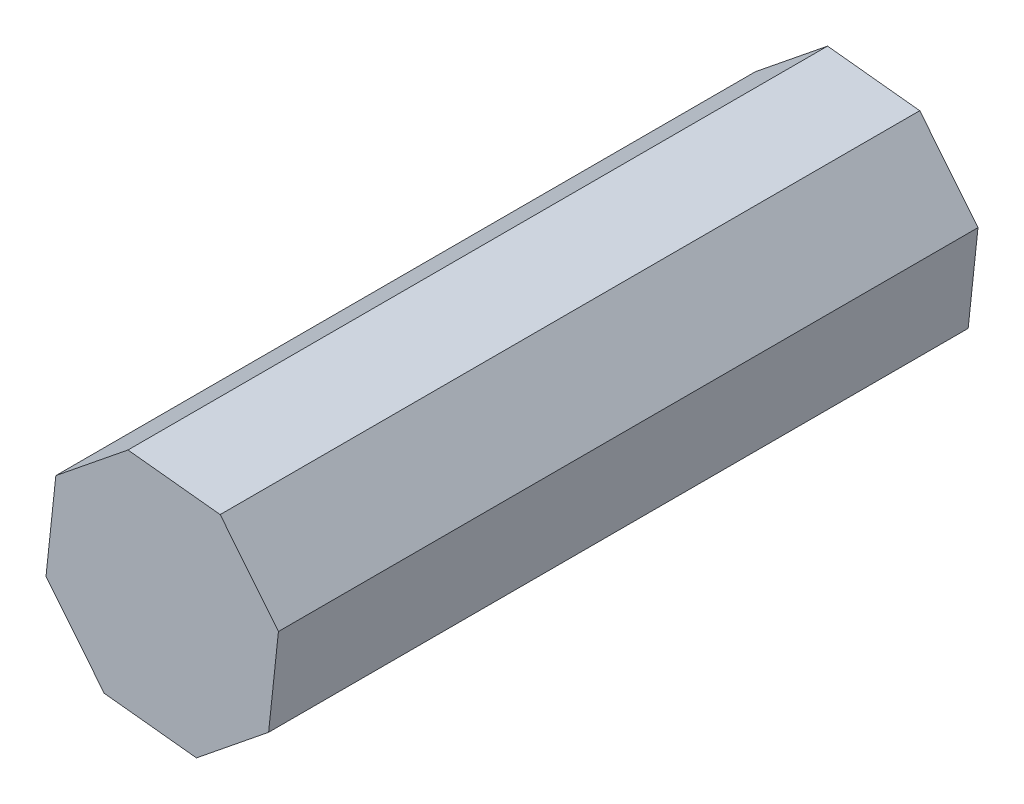
ISO-10303-21;
HEADER;
FILE_DESCRIPTION(('STEP AP214'),'2;1');
FILE_NAME('part.step','',(''),(''),'','','');
FILE_SCHEMA(('AUTOMOTIVE_DESIGN { 1 0 10303 214 1 1 1 1 }'));
ENDSEC;
DATA;
#1=APPLICATION_CONTEXT('core data for automotive mechanical design processes');
#2=APPLICATION_PROTOCOL_DEFINITION('international standard','automotive_design',2000,#1);
#3=PRODUCT_CONTEXT('',#1,'mechanical');
#4=PRODUCT('Part','Part','',(#3));
#5=PRODUCT_RELATED_PRODUCT_CATEGORY('part','',(#4));
#6=PRODUCT_DEFINITION_FORMATION('','',#4);
#7=PRODUCT_DEFINITION_CONTEXT('part definition',#1,'design');
#8=PRODUCT_DEFINITION('design','',#6,#7);
#9=PRODUCT_DEFINITION_SHAPE('','',#8);
#10=(LENGTH_UNIT() NAMED_UNIT(*) SI_UNIT(.MILLI.,.METRE.));
#11=(NAMED_UNIT(*) PLANE_ANGLE_UNIT() SI_UNIT($,.RADIAN.));
#12=(NAMED_UNIT(*) SI_UNIT($,.STERADIAN.) SOLID_ANGLE_UNIT());
#13=UNCERTAINTY_MEASURE_WITH_UNIT(LENGTH_MEASURE(1.E-05),#10,'distance_accuracy_value','');
#14=(GEOMETRIC_REPRESENTATION_CONTEXT(3) GLOBAL_UNCERTAINTY_ASSIGNED_CONTEXT((#13)) GLOBAL_UNIT_ASSIGNED_CONTEXT((#10,
#11,#12)) REPRESENTATION_CONTEXT('',''));
#15=CARTESIAN_POINT('',(0.,0.,0.));
#16=DIRECTION('',(0.,0.,1.));
#17=DIRECTION('',(1.,0.,0.));
#18=AXIS2_PLACEMENT_3D('',#15,#16,#17);
#19=CARTESIAN_POINT('',(0.,0.,0.));
#20=DIRECTION('',(0.,0.,1.));
#21=DIRECTION('',(1.,0.,0.));
#22=AXIS2_PLACEMENT_3D('',#19,#20,#21);
#23=PLANE('',#22);
#24=DIRECTION('',(0.778081418448059,0.628163439134957,0.));
#25=VECTOR('',#24,1.);
#26=CARTESIAN_POINT('',(4.8939450077324,-16.612403749195,0.));
#27=LINE('',#26,#25);
#28=CARTESIAN_POINT('',(4.8939450077324,-16.612403749195,0.));
#29=VERTEX_POINT('',#28);
#30=CARTESIAN_POINT('',(15.2072850445862,-8.28620164114293,0.));
#31=VERTEX_POINT('',#30);
#32=EDGE_CURVE('E153',#29,#31,#27,.T.);
#33=ORIENTED_EDGE('',*,*,#32,.F.);
#34=DIRECTION('',(0.994365274805661,-0.106008019794079,0.));
#35=VECTOR('',#34,1.);
#36=CARTESIAN_POINT('',(-8.28620164114293,-15.2072850445862,0.));
#37=LINE('',#36,#35);
#38=CARTESIAN_POINT('',(-8.28620164114293,-15.2072850445862,0.));
#39=VERTEX_POINT('',#38);
#40=EDGE_CURVE('E97',#39,#29,#37,.T.);
#41=ORIENTED_EDGE('',*,*,#40,.F.);
#42=DIRECTION('',(0.628163439134957,-0.778081418448059,0.));
#43=VECTOR('',#42,1.);
#44=CARTESIAN_POINT('',(-16.612403749195,-4.8939450077324,0.));
#45=LINE('',#44,#43);
#46=CARTESIAN_POINT('',(-16.612403749195,-4.8939450077324,0.));
#47=VERTEX_POINT('',#46);
#48=EDGE_CURVE('E172',#47,#39,#45,.T.);
#49=ORIENTED_EDGE('',*,*,#48,.F.);
#50=DIRECTION('',(-0.106008019794079,-0.994365274805661,0.));
#51=VECTOR('',#50,1.);
#52=CARTESIAN_POINT('',(-15.2072850445862,8.28620164114293,0.));
#53=LINE('',#52,#51);
#54=CARTESIAN_POINT('',(-15.2072850445862,8.28620164114293,0.));
#55=VERTEX_POINT('',#54);
#56=EDGE_CURVE('E138',#55,#47,#53,.T.);
#57=ORIENTED_EDGE('',*,*,#56,.F.);
#58=DIRECTION('',(-0.778081418448059,-0.628163439134957,0.));
#59=VECTOR('',#58,1.);
#60=CARTESIAN_POINT('',(-4.8939450077324,16.6124037491949,0.));
#61=LINE('',#60,#59);
#62=CARTESIAN_POINT('',(-4.8939450077324,16.6124037491949,0.));
#63=VERTEX_POINT('',#62);
#64=EDGE_CURVE('E167',#63,#55,#61,.T.);
#65=ORIENTED_EDGE('',*,*,#64,.F.);
#66=DIRECTION('',(-0.994365274805661,0.106008019794079,0.));
#67=VECTOR('',#66,1.);
#68=CARTESIAN_POINT('',(8.28620164114293,15.2072850445862,0.));
#69=LINE('',#68,#67);
#70=CARTESIAN_POINT('',(8.28620164114293,15.2072850445862,0.));
#71=VERTEX_POINT('',#70);
#72=EDGE_CURVE('E164',#71,#63,#69,.T.);
#73=ORIENTED_EDGE('',*,*,#72,.F.);
#74=DIRECTION('',(-0.628163439134957,0.778081418448059,0.));
#75=VECTOR('',#74,1.);
#76=CARTESIAN_POINT('',(16.612403749195,4.89394500773241,0.));
#77=LINE('',#76,#75);
#78=CARTESIAN_POINT('',(16.612403749195,4.89394500773241,0.));
#79=VERTEX_POINT('',#78);
#80=EDGE_CURVE('E161',#79,#71,#77,.T.);
#81=ORIENTED_EDGE('',*,*,#80,.F.);
#82=DIRECTION('',(0.106008019794079,0.994365274805661,0.));
#83=VECTOR('',#82,1.);
#84=CARTESIAN_POINT('',(15.2072850445862,-8.28620164114293,0.));
#85=LINE('',#84,#83);
#86=EDGE_CURVE('E157',#31,#79,#85,.T.);
#87=ORIENTED_EDGE('',*,*,#86,.F.);
#88=EDGE_LOOP('',(#33,#41,#49,#57,#65,#73,#81,#87));
#89=FACE_BOUND('',#88,.T.);
#90=DIRECTION('',(0.778081418448059,0.628163439134957,0.));
#91=VECTOR('',#90,1.);
#92=CARTESIAN_POINT('',(3.51752297430767,-11.9401651947339,0.));
#93=LINE('',#92,#91);
#94=CARTESIAN_POINT('',(3.51752297430767,-11.9401651947339,0.));
#95=VERTEX_POINT('',#94);
#96=CARTESIAN_POINT('',(10.9302361257963,-5.95570742957148,0.));
#97=VERTEX_POINT('',#96);
#98=EDGE_CURVE('E55',#95,#97,#93,.T.);
#99=ORIENTED_EDGE('',*,*,#98,.T.);
#100=DIRECTION('',(0.106008019794079,0.994365274805661,0.));
#101=VECTOR('',#100,1.);
#102=CARTESIAN_POINT('',(10.9302361257963,-5.95570742957148,0.));
#103=LINE('',#102,#101);
#104=CARTESIAN_POINT('',(11.9401651947339,3.51752297430767,0.));
#105=VERTEX_POINT('',#104);
#106=EDGE_CURVE('E276',#97,#105,#103,.T.);
#107=ORIENTED_EDGE('',*,*,#106,.T.);
#108=DIRECTION('',(-0.628163439134958,0.778081418448058,0.));
#109=VECTOR('',#108,1.);
#110=CARTESIAN_POINT('',(11.9401651947339,3.51752297430767,0.));
#111=LINE('',#110,#109);
#112=CARTESIAN_POINT('',(5.95570742957148,10.9302361257963,0.));
#113=VERTEX_POINT('',#112);
#114=EDGE_CURVE('E272',#105,#113,#111,.T.);
#115=ORIENTED_EDGE('',*,*,#114,.T.);
#116=DIRECTION('',(-0.994365274805661,0.106008019794078,0.));
#117=VECTOR('',#116,1.);
#118=CARTESIAN_POINT('',(5.95570742957148,10.9302361257963,0.));
#119=LINE('',#118,#117);
#120=CARTESIAN_POINT('',(-3.51752297430768,11.9401651947339,0.));
#121=VERTEX_POINT('',#120);
#122=EDGE_CURVE('E268',#113,#121,#119,.T.);
#123=ORIENTED_EDGE('',*,*,#122,.T.);
#124=DIRECTION('',(-0.778081418448058,-0.628163439134957,0.));
#125=VECTOR('',#124,1.);
#126=CARTESIAN_POINT('',(-3.51752297430768,11.9401651947339,0.));
#127=LINE('',#126,#125);
#128=CARTESIAN_POINT('',(-10.9302361257963,5.95570742957148,0.));
#129=VERTEX_POINT('',#128);
#130=EDGE_CURVE('E264',#121,#129,#127,.T.);
#131=ORIENTED_EDGE('',*,*,#130,.T.);
#132=DIRECTION('',(-0.106008019794079,-0.994365274805661,0.));
#133=VECTOR('',#132,1.);
#134=CARTESIAN_POINT('',(-10.9302361257963,5.95570742957148,0.));
#135=LINE('',#134,#133);
#136=CARTESIAN_POINT('',(-11.9401651947339,-3.51752297430767,0.));
#137=VERTEX_POINT('',#136);
#138=EDGE_CURVE('E260',#129,#137,#135,.T.);
#139=ORIENTED_EDGE('',*,*,#138,.T.);
#140=DIRECTION('',(0.628163439134957,-0.778081418448058,0.));
#141=VECTOR('',#140,1.);
#142=CARTESIAN_POINT('',(-11.9401651947339,-3.51752297430767,0.));
#143=LINE('',#142,#141);
#144=CARTESIAN_POINT('',(-5.95570742957148,-10.9302361257963,0.));
#145=VERTEX_POINT('',#144);
#146=EDGE_CURVE('E256',#137,#145,#143,.T.);
#147=ORIENTED_EDGE('',*,*,#146,.T.);
#148=DIRECTION('',(0.994365274805661,-0.106008019794079,0.));
#149=VECTOR('',#148,1.);
#150=CARTESIAN_POINT('',(-5.95570742957148,-10.9302361257963,0.));
#151=LINE('',#150,#149);
#152=EDGE_CURVE('E251',#145,#95,#151,.T.);
#153=ORIENTED_EDGE('',*,*,#152,.T.);
#154=EDGE_LOOP('',(#99,#107,#115,#123,#131,#139,#147,#153));
#155=FACE_BOUND('',#154,.T.);
#156=ADVANCED_FACE('F39',(#89,#155),#23,.F.);
#157=CARTESIAN_POINT('',(4.8939450077324,-16.612403749195,100.));
#158=DIRECTION('',(-0.628163439134957,0.778081418448059,0.));
#159=DIRECTION('',(-0.778081418448059,-0.628163439134957,0.));
#160=AXIS2_PLACEMENT_3D('',#157,#158,#159);
#161=PLANE('',#160);
#162=ORIENTED_EDGE('',*,*,#32,.T.);
#163=DIRECTION('',(0.,0.,-1.));
#164=VECTOR('',#163,1.);
#165=CARTESIAN_POINT('',(15.2072850445862,-8.28620164114293,100.));
#166=LINE('',#165,#164);
#167=CARTESIAN_POINT('',(15.2072850445862,-8.28620164114293,100.));
#168=VERTEX_POINT('',#167);
#169=EDGE_CURVE('E11',#168,#31,#166,.T.);
#170=ORIENTED_EDGE('',*,*,#169,.F.);
#171=DIRECTION('',(0.778081418448059,0.628163439134957,0.));
#172=VECTOR('',#171,1.);
#173=CARTESIAN_POINT('',(4.8939450077324,-16.612403749195,100.));
#174=LINE('',#173,#172);
#175=CARTESIAN_POINT('',(4.8939450077324,-16.612403749195,100.));
#176=VERTEX_POINT('',#175);
#177=EDGE_CURVE('E177',#176,#168,#174,.T.);
#178=ORIENTED_EDGE('',*,*,#177,.F.);
#179=DIRECTION('',(0.,0.,-1.));
#180=VECTOR('',#179,1.);
#181=CARTESIAN_POINT('',(4.8939450077324,-16.612403749195,100.));
#182=LINE('',#181,#180);
#183=EDGE_CURVE('E149',#176,#29,#182,.T.);
#184=ORIENTED_EDGE('',*,*,#183,.T.);
#185=EDGE_LOOP('',(#162,#170,#178,#184));
#186=FACE_BOUND('',#185,.T.);
#187=ADVANCED_FACE('F41',(#186),#161,.F.);
#188=CARTESIAN_POINT('',(15.2072850445862,-8.28620164114293,100.));
#189=DIRECTION('',(-0.994365274805661,0.106008019794079,0.));
#190=DIRECTION('',(-0.106008019794079,-0.994365274805661,0.));
#191=AXIS2_PLACEMENT_3D('',#188,#189,#190);
#192=PLANE('',#191);
#193=ORIENTED_EDGE('',*,*,#86,.T.);
#194=DIRECTION('',(0.,0.,-1.));
#195=VECTOR('',#194,1.);
#196=CARTESIAN_POINT('',(16.612403749195,4.89394500773241,100.));
#197=LINE('',#196,#195);
#198=CARTESIAN_POINT('',(16.612403749195,4.89394500773241,100.));
#199=VERTEX_POINT('',#198);
#200=EDGE_CURVE('E48',#199,#79,#197,.T.);
#201=ORIENTED_EDGE('',*,*,#200,.F.);
#202=DIRECTION('',(0.106008019794079,0.994365274805661,0.));
#203=VECTOR('',#202,1.);
#204=CARTESIAN_POINT('',(15.2072850445862,-8.28620164114293,100.));
#205=LINE('',#204,#203);
#206=EDGE_CURVE('E105',#168,#199,#205,.T.);
#207=ORIENTED_EDGE('',*,*,#206,.F.);
#208=ORIENTED_EDGE('',*,*,#169,.T.);
#209=EDGE_LOOP('',(#193,#201,#207,#208));
#210=FACE_BOUND('',#209,.T.);
#211=ADVANCED_FACE('F389',(#210),#192,.F.);
#212=CARTESIAN_POINT('',(16.612403749195,4.89394500773241,100.));
#213=DIRECTION('',(-0.778081418448059,-0.628163439134957,0.));
#214=DIRECTION('',(0.628163439134957,-0.778081418448059,0.));
#215=AXIS2_PLACEMENT_3D('',#212,#213,#214);
#216=PLANE('',#215);
#217=ORIENTED_EDGE('',*,*,#80,.T.);
#218=DIRECTION('',(0.,0.,-1.));
#219=VECTOR('',#218,1.);
#220=CARTESIAN_POINT('',(8.28620164114293,15.2072850445862,100.));
#221=LINE('',#220,#219);
#222=CARTESIAN_POINT('',(8.28620164114293,15.2072850445862,100.));
#223=VERTEX_POINT('',#222);
#224=EDGE_CURVE('E188',#223,#71,#221,.T.);
#225=ORIENTED_EDGE('',*,*,#224,.F.);
#226=DIRECTION('',(-0.628163439134957,0.778081418448059,0.));
#227=VECTOR('',#226,1.);
#228=CARTESIAN_POINT('',(16.612403749195,4.89394500773241,100.));
#229=LINE('',#228,#227);
#230=EDGE_CURVE('E198',#199,#223,#229,.T.);
#231=ORIENTED_EDGE('',*,*,#230,.F.);
#232=ORIENTED_EDGE('',*,*,#200,.T.);
#233=EDGE_LOOP('',(#217,#225,#231,#232));
#234=FACE_BOUND('',#233,.T.);
#235=ADVANCED_FACE('F196',(#234),#216,.F.);
#236=CARTESIAN_POINT('',(8.28620164114293,15.2072850445862,100.));
#237=DIRECTION('',(-0.106008019794079,-0.994365274805661,0.));
#238=DIRECTION('',(0.994365274805661,-0.106008019794079,0.));
#239=AXIS2_PLACEMENT_3D('',#236,#237,#238);
#240=PLANE('',#239);
#241=ORIENTED_EDGE('',*,*,#72,.T.);
#242=DIRECTION('',(0.,0.,-1.));
#243=VECTOR('',#242,1.);
#244=CARTESIAN_POINT('',(-4.8939450077324,16.6124037491949,100.));
#245=LINE('',#244,#243);
#246=CARTESIAN_POINT('',(-4.8939450077324,16.6124037491949,100.));
#247=VERTEX_POINT('',#246);
#248=EDGE_CURVE('E184',#247,#63,#245,.T.);
#249=ORIENTED_EDGE('',*,*,#248,.F.);
#250=DIRECTION('',(-0.994365274805661,0.106008019794079,0.));
#251=VECTOR('',#250,1.);
#252=CARTESIAN_POINT('',(8.28620164114293,15.2072850445862,100.));
#253=LINE('',#252,#251);
#254=EDGE_CURVE('E211',#223,#247,#253,.T.);
#255=ORIENTED_EDGE('',*,*,#254,.F.);
#256=ORIENTED_EDGE('',*,*,#224,.T.);
#257=EDGE_LOOP('',(#241,#249,#255,#256));
#258=FACE_BOUND('',#257,.T.);
#259=ADVANCED_FACE('F206',(#258),#240,.F.);
#260=CARTESIAN_POINT('',(-4.8939450077324,16.6124037491949,100.));
#261=DIRECTION('',(0.628163439134957,-0.778081418448059,0.));
#262=DIRECTION('',(0.778081418448059,0.628163439134957,0.));
#263=AXIS2_PLACEMENT_3D('',#260,#261,#262);
#264=PLANE('',#263);
#265=ORIENTED_EDGE('',*,*,#64,.T.);
#266=DIRECTION('',(0.,0.,-1.));
#267=VECTOR('',#266,1.);
#268=CARTESIAN_POINT('',(-15.2072850445862,8.28620164114293,100.));
#269=LINE('',#268,#267);
#270=CARTESIAN_POINT('',(-15.2072850445862,8.28620164114293,100.));
#271=VERTEX_POINT('',#270);
#272=EDGE_CURVE('E142',#271,#55,#269,.T.);
#273=ORIENTED_EDGE('',*,*,#272,.F.);
#274=DIRECTION('',(-0.778081418448059,-0.628163439134957,0.));
#275=VECTOR('',#274,1.);
#276=CARTESIAN_POINT('',(-4.8939450077324,16.6124037491949,100.));
#277=LINE('',#276,#275);
#278=EDGE_CURVE('E128',#247,#271,#277,.T.);
#279=ORIENTED_EDGE('',*,*,#278,.F.);
#280=ORIENTED_EDGE('',*,*,#248,.T.);
#281=EDGE_LOOP('',(#265,#273,#279,#280));
#282=FACE_BOUND('',#281,.T.);
#283=ADVANCED_FACE('F209',(#282),#264,.F.);
#284=CARTESIAN_POINT('',(-15.2072850445862,8.28620164114293,100.));
#285=DIRECTION('',(0.994365274805661,-0.106008019794079,0.));
#286=DIRECTION('',(0.106008019794079,0.994365274805661,0.));
#287=AXIS2_PLACEMENT_3D('',#284,#285,#286);
#288=PLANE('',#287);
#289=ORIENTED_EDGE('',*,*,#56,.T.);
#290=DIRECTION('',(0.,0.,-1.));
#291=VECTOR('',#290,1.);
#292=CARTESIAN_POINT('',(-16.612403749195,-4.8939450077324,100.));
#293=LINE('',#292,#291);
#294=CARTESIAN_POINT('',(-16.612403749195,-4.8939450077324,100.));
#295=VERTEX_POINT('',#294);
#296=EDGE_CURVE('E135',#295,#47,#293,.T.);
#297=ORIENTED_EDGE('',*,*,#296,.F.);
#298=DIRECTION('',(-0.106008019794079,-0.994365274805661,0.));
#299=VECTOR('',#298,1.);
#300=CARTESIAN_POINT('',(-15.2072850445862,8.28620164114293,100.));
#301=LINE('',#300,#299);
#302=EDGE_CURVE('E121',#271,#295,#301,.T.);
#303=ORIENTED_EDGE('',*,*,#302,.F.);
#304=ORIENTED_EDGE('',*,*,#272,.T.);
#305=EDGE_LOOP('',(#289,#297,#303,#304));
#306=FACE_BOUND('',#305,.T.);
#307=ADVANCED_FACE('F136',(#306),#288,.F.);
#308=CARTESIAN_POINT('',(-16.612403749195,-4.8939450077324,100.));
#309=DIRECTION('',(0.778081418448059,0.628163439134957,0.));
#310=DIRECTION('',(-0.628163439134957,0.778081418448059,0.));
#311=AXIS2_PLACEMENT_3D('',#308,#309,#310);
#312=PLANE('',#311);
#313=ORIENTED_EDGE('',*,*,#48,.T.);
#314=DIRECTION('',(0.,0.,-1.));
#315=VECTOR('',#314,1.);
#316=CARTESIAN_POINT('',(-8.28620164114293,-15.2072850445862,100.));
#317=LINE('',#316,#315);
#318=CARTESIAN_POINT('',(-8.28620164114293,-15.2072850445862,100.));
#319=VERTEX_POINT('',#318);
#320=EDGE_CURVE('E143',#319,#39,#317,.T.);
#321=ORIENTED_EDGE('',*,*,#320,.F.);
#322=DIRECTION('',(0.628163439134957,-0.778081418448059,0.));
#323=VECTOR('',#322,1.);
#324=CARTESIAN_POINT('',(-16.612403749195,-4.8939450077324,100.));
#325=LINE('',#324,#323);
#326=EDGE_CURVE('E125',#295,#319,#325,.T.);
#327=ORIENTED_EDGE('',*,*,#326,.F.);
#328=ORIENTED_EDGE('',*,*,#296,.T.);
#329=EDGE_LOOP('',(#313,#321,#327,#328));
#330=FACE_BOUND('',#329,.T.);
#331=ADVANCED_FACE('F145',(#330),#312,.F.);
#332=CARTESIAN_POINT('',(-8.28620164114293,-15.2072850445862,100.));
#333=DIRECTION('',(0.106008019794079,0.994365274805661,0.));
#334=DIRECTION('',(-0.994365274805661,0.106008019794079,0.));
#335=AXIS2_PLACEMENT_3D('',#332,#333,#334);
#336=PLANE('',#335);
#337=ORIENTED_EDGE('',*,*,#40,.T.);
#338=ORIENTED_EDGE('',*,*,#183,.F.);
#339=DIRECTION('',(0.994365274805661,-0.106008019794079,0.));
#340=VECTOR('',#339,1.);
#341=CARTESIAN_POINT('',(-8.28620164114293,-15.2072850445862,100.));
#342=LINE('',#341,#340);
#343=EDGE_CURVE('E64',#319,#176,#342,.T.);
#344=ORIENTED_EDGE('',*,*,#343,.F.);
#345=ORIENTED_EDGE('',*,*,#320,.T.);
#346=EDGE_LOOP('',(#337,#338,#344,#345));
#347=FACE_BOUND('',#346,.T.);
#348=ADVANCED_FACE('F394',(#347),#336,.F.);
#349=CARTESIAN_POINT('',(0.,0.,100.));
#350=DIRECTION('',(0.,0.,1.));
#351=DIRECTION('',(1.,0.,0.));
#352=AXIS2_PLACEMENT_3D('',#349,#350,#351);
#353=PLANE('',#352);
#354=ORIENTED_EDGE('',*,*,#177,.T.);
#355=ORIENTED_EDGE('',*,*,#206,.T.);
#356=ORIENTED_EDGE('',*,*,#230,.T.);
#357=ORIENTED_EDGE('',*,*,#254,.T.);
#358=ORIENTED_EDGE('',*,*,#278,.T.);
#359=ORIENTED_EDGE('',*,*,#302,.T.);
#360=ORIENTED_EDGE('',*,*,#326,.T.);
#361=ORIENTED_EDGE('',*,*,#343,.T.);
#362=EDGE_LOOP('',(#354,#355,#356,#357,#358,#359,#360,#361));
#363=FACE_BOUND('',#362,.T.);
#364=ADVANCED_FACE('F123',(#363),#353,.T.);
#365=CARTESIAN_POINT('',(3.51752297430767,-11.9401651947339,20.));
#366=DIRECTION('',(-0.628163439134957,0.778081418448059,0.));
#367=DIRECTION('',(-0.778081418448059,-0.628163439134957,0.));
#368=AXIS2_PLACEMENT_3D('',#365,#366,#367);
#369=PLANE('',#368);
#370=ORIENTED_EDGE('',*,*,#98,.F.);
#371=DIRECTION('',(0.,0.,-1.));
#372=VECTOR('',#371,1.);
#373=CARTESIAN_POINT('',(3.51752297430767,-11.9401651947339,20.));
#374=LINE('',#373,#372);
#375=CARTESIAN_POINT('',(3.51752297430767,-11.9401651947339,20.));
#376=VERTEX_POINT('',#375);
#377=EDGE_CURVE('E247',#376,#95,#374,.T.);
#378=ORIENTED_EDGE('',*,*,#377,.F.);
#379=DIRECTION('',(0.778081418448059,0.628163439134957,0.));
#380=VECTOR('',#379,1.);
#381=CARTESIAN_POINT('',(3.51752297430767,-11.9401651947339,20.));
#382=LINE('',#381,#380);
#383=CARTESIAN_POINT('',(10.9302361257963,-5.95570742957148,20.));
#384=VERTEX_POINT('',#383);
#385=EDGE_CURVE('E255',#376,#384,#382,.T.);
#386=ORIENTED_EDGE('',*,*,#385,.T.);
#387=DIRECTION('',(0.,0.,-1.));
#388=VECTOR('',#387,1.);
#389=CARTESIAN_POINT('',(10.9302361257963,-5.95570742957148,20.));
#390=LINE('',#389,#388);
#391=EDGE_CURVE('E158',#384,#97,#390,.T.);
#392=ORIENTED_EDGE('',*,*,#391,.T.);
#393=EDGE_LOOP('',(#370,#378,#386,#392));
#394=FACE_BOUND('',#393,.T.);
#395=ADVANCED_FACE('F314',(#394),#369,.T.);
#396=CARTESIAN_POINT('',(10.9302361257963,-5.95570742957148,20.));
#397=DIRECTION('',(-0.994365274805661,0.106008019794079,0.));
#398=DIRECTION('',(-0.106008019794079,-0.994365274805661,0.));
#399=AXIS2_PLACEMENT_3D('',#396,#397,#398);
#400=PLANE('',#399);
#401=ORIENTED_EDGE('',*,*,#106,.F.);
#402=ORIENTED_EDGE('',*,*,#391,.F.);
#403=DIRECTION('',(0.106008019794079,0.994365274805661,0.));
#404=VECTOR('',#403,1.);
#405=CARTESIAN_POINT('',(10.9302361257963,-5.95570742957148,20.));
#406=LINE('',#405,#404);
#407=CARTESIAN_POINT('',(11.9401651947339,3.51752297430767,20.));
#408=VERTEX_POINT('',#407);
#409=EDGE_CURVE('E305',#384,#408,#406,.T.);
#410=ORIENTED_EDGE('',*,*,#409,.T.);
#411=DIRECTION('',(0.,0.,-1.));
#412=VECTOR('',#411,1.);
#413=CARTESIAN_POINT('',(11.9401651947339,3.51752297430767,20.));
#414=LINE('',#413,#412);
#415=EDGE_CURVE('E223',#408,#105,#414,.T.);
#416=ORIENTED_EDGE('',*,*,#415,.T.);
#417=EDGE_LOOP('',(#401,#402,#410,#416));
#418=FACE_BOUND('',#417,.T.);
#419=ADVANCED_FACE('F323',(#418),#400,.T.);
#420=CARTESIAN_POINT('',(11.9401651947339,3.51752297430767,20.));
#421=DIRECTION('',(-0.778081418448058,-0.628163439134958,0.));
#422=DIRECTION('',(0.628163439134958,-0.778081418448058,0.));
#423=AXIS2_PLACEMENT_3D('',#420,#421,#422);
#424=PLANE('',#423);
#425=ORIENTED_EDGE('',*,*,#114,.F.);
#426=ORIENTED_EDGE('',*,*,#415,.F.);
#427=DIRECTION('',(-0.628163439134958,0.778081418448058,0.));
#428=VECTOR('',#427,1.);
#429=CARTESIAN_POINT('',(11.9401651947339,3.51752297430767,20.));
#430=LINE('',#429,#428);
#431=CARTESIAN_POINT('',(5.95570742957148,10.9302361257963,20.));
#432=VERTEX_POINT('',#431);
#433=EDGE_CURVE('E301',#408,#432,#430,.T.);
#434=ORIENTED_EDGE('',*,*,#433,.T.);
#435=DIRECTION('',(0.,0.,-1.));
#436=VECTOR('',#435,1.);
#437=CARTESIAN_POINT('',(5.95570742957148,10.9302361257963,20.));
#438=LINE('',#437,#436);
#439=EDGE_CURVE('E227',#432,#113,#438,.T.);
#440=ORIENTED_EDGE('',*,*,#439,.T.);
#441=EDGE_LOOP('',(#425,#426,#434,#440));
#442=FACE_BOUND('',#441,.T.);
#443=ADVANCED_FACE('F370',(#442),#424,.T.);
#444=CARTESIAN_POINT('',(5.95570742957148,10.9302361257963,20.));
#445=DIRECTION('',(-0.106008019794078,-0.994365274805661,0.));
#446=DIRECTION('',(0.994365274805661,-0.106008019794078,0.));
#447=AXIS2_PLACEMENT_3D('',#444,#445,#446);
#448=PLANE('',#447);
#449=ORIENTED_EDGE('',*,*,#122,.F.);
#450=ORIENTED_EDGE('',*,*,#439,.F.);
#451=DIRECTION('',(-0.994365274805661,0.106008019794078,0.));
#452=VECTOR('',#451,1.);
#453=CARTESIAN_POINT('',(5.95570742957148,10.9302361257963,20.));
#454=LINE('',#453,#452);
#455=CARTESIAN_POINT('',(-3.51752297430768,11.9401651947339,20.));
#456=VERTEX_POINT('',#455);
#457=EDGE_CURVE('E297',#432,#456,#454,.T.);
#458=ORIENTED_EDGE('',*,*,#457,.T.);
#459=DIRECTION('',(0.,0.,-1.));
#460=VECTOR('',#459,1.);
#461=CARTESIAN_POINT('',(-3.51752297430768,11.9401651947339,20.));
#462=LINE('',#461,#460);
#463=EDGE_CURVE('E231',#456,#121,#462,.T.);
#464=ORIENTED_EDGE('',*,*,#463,.T.);
#465=EDGE_LOOP('',(#449,#450,#458,#464));
#466=FACE_BOUND('',#465,.T.);
#467=ADVANCED_FACE('F373',(#466),#448,.T.);
#468=CARTESIAN_POINT('',(-3.51752297430768,11.9401651947339,20.));
#469=DIRECTION('',(0.628163439134957,-0.778081418448058,0.));
#470=DIRECTION('',(0.778081418448058,0.628163439134957,0.));
#471=AXIS2_PLACEMENT_3D('',#468,#469,#470);
#472=PLANE('',#471);
#473=ORIENTED_EDGE('',*,*,#130,.F.);
#474=ORIENTED_EDGE('',*,*,#463,.F.);
#475=DIRECTION('',(-0.778081418448058,-0.628163439134957,0.));
#476=VECTOR('',#475,1.);
#477=CARTESIAN_POINT('',(-3.51752297430768,11.9401651947339,20.));
#478=LINE('',#477,#476);
#479=CARTESIAN_POINT('',(-10.9302361257963,5.95570742957148,20.));
#480=VERTEX_POINT('',#479);
#481=EDGE_CURVE('E293',#456,#480,#478,.T.);
#482=ORIENTED_EDGE('',*,*,#481,.T.);
#483=DIRECTION('',(0.,0.,-1.));
#484=VECTOR('',#483,1.);
#485=CARTESIAN_POINT('',(-10.9302361257963,5.95570742957148,20.));
#486=LINE('',#485,#484);
#487=EDGE_CURVE('E235',#480,#129,#486,.T.);
#488=ORIENTED_EDGE('',*,*,#487,.T.);
#489=EDGE_LOOP('',(#473,#474,#482,#488));
#490=FACE_BOUND('',#489,.T.);
#491=ADVANCED_FACE('F375',(#490),#472,.T.);
#492=CARTESIAN_POINT('',(-10.9302361257963,5.95570742957148,20.));
#493=DIRECTION('',(0.994365274805661,-0.106008019794079,0.));
#494=DIRECTION('',(0.106008019794079,0.994365274805661,0.));
#495=AXIS2_PLACEMENT_3D('',#492,#493,#494);
#496=PLANE('',#495);
#497=ORIENTED_EDGE('',*,*,#138,.F.);
#498=ORIENTED_EDGE('',*,*,#487,.F.);
#499=DIRECTION('',(-0.106008019794079,-0.994365274805661,0.));
#500=VECTOR('',#499,1.);
#501=CARTESIAN_POINT('',(-10.9302361257963,5.95570742957148,20.));
#502=LINE('',#501,#500);
#503=CARTESIAN_POINT('',(-11.9401651947339,-3.51752297430767,20.));
#504=VERTEX_POINT('',#503);
#505=EDGE_CURVE('E289',#480,#504,#502,.T.);
#506=ORIENTED_EDGE('',*,*,#505,.T.);
#507=DIRECTION('',(0.,0.,-1.));
#508=VECTOR('',#507,1.);
#509=CARTESIAN_POINT('',(-11.9401651947339,-3.51752297430767,20.));
#510=LINE('',#509,#508);
#511=EDGE_CURVE('E239',#504,#137,#510,.T.);
#512=ORIENTED_EDGE('',*,*,#511,.T.);
#513=EDGE_LOOP('',(#497,#498,#506,#512));
#514=FACE_BOUND('',#513,.T.);
#515=ADVANCED_FACE('F351',(#514),#496,.T.);
#516=CARTESIAN_POINT('',(-11.9401651947339,-3.51752297430767,20.));
#517=DIRECTION('',(0.778081418448058,0.628163439134957,0.));
#518=DIRECTION('',(-0.628163439134958,0.778081418448059,0.));
#519=AXIS2_PLACEMENT_3D('',#516,#517,#518);
#520=PLANE('',#519);
#521=ORIENTED_EDGE('',*,*,#146,.F.);
#522=ORIENTED_EDGE('',*,*,#511,.F.);
#523=DIRECTION('',(0.628163439134957,-0.778081418448058,0.));
#524=VECTOR('',#523,1.);
#525=CARTESIAN_POINT('',(-11.9401651947339,-3.51752297430767,20.));
#526=LINE('',#525,#524);
#527=CARTESIAN_POINT('',(-5.95570742957148,-10.9302361257963,20.));
#528=VERTEX_POINT('',#527);
#529=EDGE_CURVE('E285',#504,#528,#526,.T.);
#530=ORIENTED_EDGE('',*,*,#529,.T.);
#531=DIRECTION('',(0.,0.,-1.));
#532=VECTOR('',#531,1.);
#533=CARTESIAN_POINT('',(-5.95570742957148,-10.9302361257963,20.));
#534=LINE('',#533,#532);
#535=EDGE_CURVE('E243',#528,#145,#534,.T.);
#536=ORIENTED_EDGE('',*,*,#535,.T.);
#537=EDGE_LOOP('',(#521,#522,#530,#536));
#538=FACE_BOUND('',#537,.T.);
#539=ADVANCED_FACE('F344',(#538),#520,.T.);
#540=CARTESIAN_POINT('',(-5.95570742957148,-10.9302361257963,20.));
#541=DIRECTION('',(0.106008019794079,0.994365274805661,0.));
#542=DIRECTION('',(-0.994365274805661,0.106008019794079,0.));
#543=AXIS2_PLACEMENT_3D('',#540,#541,#542);
#544=PLANE('',#543);
#545=ORIENTED_EDGE('',*,*,#152,.F.);
#546=ORIENTED_EDGE('',*,*,#535,.F.);
#547=DIRECTION('',(0.994365274805661,-0.106008019794079,0.));
#548=VECTOR('',#547,1.);
#549=CARTESIAN_POINT('',(-5.95570742957148,-10.9302361257963,20.));
#550=LINE('',#549,#548);
#551=EDGE_CURVE('E250',#528,#376,#550,.T.);
#552=ORIENTED_EDGE('',*,*,#551,.T.);
#553=ORIENTED_EDGE('',*,*,#377,.T.);
#554=EDGE_LOOP('',(#545,#546,#552,#553));
#555=FACE_BOUND('',#554,.T.);
#556=ADVANCED_FACE('F348',(#555),#544,.T.);
#557=CARTESIAN_POINT('',(0.,0.,20.));
#558=DIRECTION('',(0.,0.,1.));
#559=DIRECTION('',(1.,0.,0.));
#560=AXIS2_PLACEMENT_3D('',#557,#558,#559);
#561=PLANE('',#560);
#562=ORIENTED_EDGE('',*,*,#385,.F.);
#563=ORIENTED_EDGE('',*,*,#551,.F.);
#564=ORIENTED_EDGE('',*,*,#529,.F.);
#565=ORIENTED_EDGE('',*,*,#505,.F.);
#566=ORIENTED_EDGE('',*,*,#481,.F.);
#567=ORIENTED_EDGE('',*,*,#457,.F.);
#568=ORIENTED_EDGE('',*,*,#433,.F.);
#569=ORIENTED_EDGE('',*,*,#409,.F.);
#570=EDGE_LOOP('',(#562,#563,#564,#565,#566,#567,#568,#569));
#571=FACE_BOUND('',#570,.T.);
#572=ADVANCED_FACE('F359',(#571),#561,.F.);
#573=CLOSED_SHELL('',(#156,#187,#211,#235,#259,#283,#307,#331,#348,#364,#395,#419,#443,#467,
#491,#515,#539,#556,#572));
#574=MANIFOLD_SOLID_BREP('B2',#573);
#575=ADVANCED_BREP_SHAPE_REPRESENTATION('',(#18,#574),#14);
#576=SHAPE_DEFINITION_REPRESENTATION(#9,#575);
ENDSEC;
END-ISO-10303-21;
